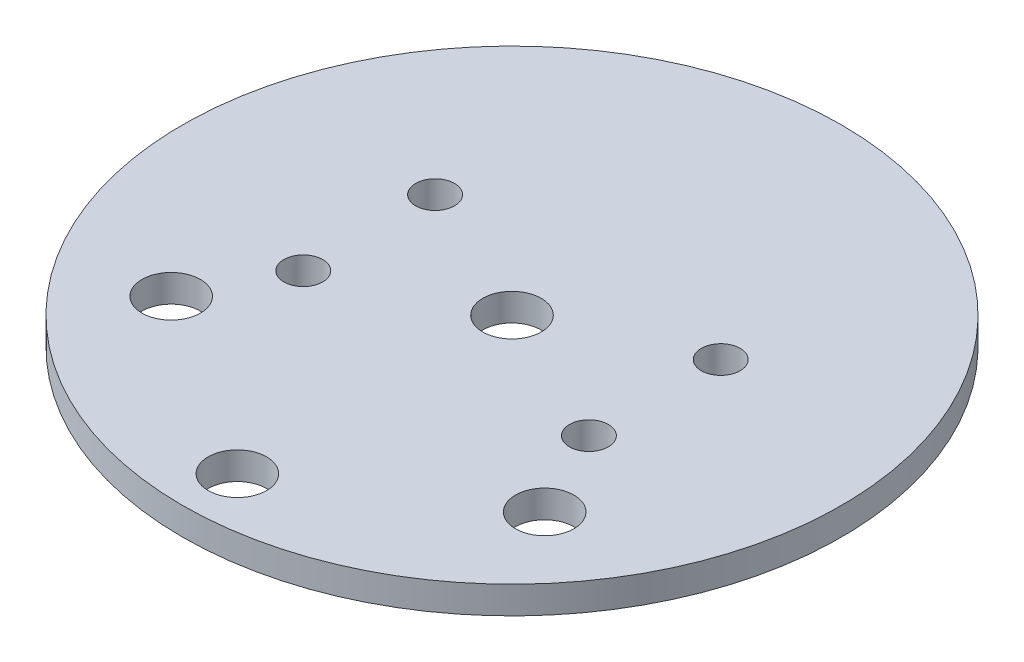
ISO-10303-21;
HEADER;
FILE_DESCRIPTION(('STEP AP214'),'2;1');
FILE_NAME('part.step','',(''),(''),'','','');
FILE_SCHEMA(('AUTOMOTIVE_DESIGN { 1 0 10303 214 1 1 1 1 }'));
ENDSEC;
DATA;
#1=APPLICATION_CONTEXT('core data for automotive mechanical design processes');
#2=APPLICATION_PROTOCOL_DEFINITION('international standard','automotive_design',2000,#1);
#3=PRODUCT_CONTEXT('',#1,'mechanical');
#4=PRODUCT('Part','Part','',(#3));
#5=PRODUCT_RELATED_PRODUCT_CATEGORY('part','',(#4));
#6=PRODUCT_DEFINITION_FORMATION('','',#4);
#7=PRODUCT_DEFINITION_CONTEXT('part definition',#1,'design');
#8=PRODUCT_DEFINITION('design','',#6,#7);
#9=PRODUCT_DEFINITION_SHAPE('','',#8);
#10=(LENGTH_UNIT() NAMED_UNIT(*) SI_UNIT(.MILLI.,.METRE.));
#11=(NAMED_UNIT(*) PLANE_ANGLE_UNIT() SI_UNIT($,.RADIAN.));
#12=(NAMED_UNIT(*) SI_UNIT($,.STERADIAN.) SOLID_ANGLE_UNIT());
#13=UNCERTAINTY_MEASURE_WITH_UNIT(LENGTH_MEASURE(1.E-05),#10,'distance_accuracy_value','');
#14=(GEOMETRIC_REPRESENTATION_CONTEXT(3) GLOBAL_UNCERTAINTY_ASSIGNED_CONTEXT((#13)) GLOBAL_UNIT_ASSIGNED_CONTEXT((#10,
#11,#12)) REPRESENTATION_CONTEXT('',''));
#15=CARTESIAN_POINT('',(0.,0.,0.));
#16=DIRECTION('',(0.,0.,1.));
#17=DIRECTION('',(1.,0.,0.));
#18=AXIS2_PLACEMENT_3D('',#15,#16,#17);
#19=CARTESIAN_POINT('',(0.,1.5875,0.));
#20=DIRECTION('',(0.,-1.,0.));
#21=DIRECTION('',(0.,0.,-1.));
#22=AXIS2_PLACEMENT_3D('',#19,#20,#21);
#23=CYLINDRICAL_SURFACE('',#22,38.1);
#24=CARTESIAN_POINT('',(0.,1.5875,0.));
#25=DIRECTION('',(0.,1.,0.));
#26=DIRECTION('',(0.,0.,1.));
#27=AXIS2_PLACEMENT_3D('',#24,#25,#26);
#28=CIRCLE('',#27,38.1);
#29=CARTESIAN_POINT('',(0.,1.5875,38.1));
#30=VERTEX_POINT('',#29);
#31=EDGE_CURVE('E10',#30,#30,#28,.T.);
#32=ORIENTED_EDGE('',*,*,#31,.F.);
#33=EDGE_LOOP('',(#32));
#34=FACE_BOUND('',#33,.T.);
#35=CARTESIAN_POINT('',(0.,-1.5875,0.));
#36=DIRECTION('',(0.,1.,0.));
#37=DIRECTION('',(0.,0.,1.));
#38=AXIS2_PLACEMENT_3D('',#35,#36,#37);
#39=CIRCLE('',#38,38.1);
#40=CARTESIAN_POINT('',(0.,-1.5875,38.1));
#41=VERTEX_POINT('',#40);
#42=EDGE_CURVE('E39',#41,#41,#39,.T.);
#43=ORIENTED_EDGE('',*,*,#42,.T.);
#44=EDGE_LOOP('',(#43));
#45=FACE_BOUND('',#44,.T.);
#46=ADVANCED_FACE('F36',(#34,#45),#23,.T.);
#47=CARTESIAN_POINT('',(0.,1.5875,0.));
#48=DIRECTION('',(0.,1.,0.));
#49=DIRECTION('',(0.,0.,1.));
#50=AXIS2_PLACEMENT_3D('',#47,#48,#49);
#51=PLANE('',#50);
#52=CARTESIAN_POINT('',(-16.51,1.5875,-7.62));
#53=DIRECTION('',(0.,1.,0.));
#54=DIRECTION('',(0.,0.,1.));
#55=AXIS2_PLACEMENT_3D('',#52,#53,#54);
#56=CIRCLE('',#55,2.24789999999999);
#57=CARTESIAN_POINT('',(-16.51,1.5875,-5.37210000000001));
#58=VERTEX_POINT('',#57);
#59=EDGE_CURVE('E92',#58,#58,#56,.T.);
#60=ORIENTED_EDGE('',*,*,#59,.F.);
#61=EDGE_LOOP('',(#60));
#62=FACE_BOUND('',#61,.T.);
#63=CARTESIAN_POINT('',(-16.51,1.5875,7.62));
#64=DIRECTION('',(0.,1.,0.));
#65=DIRECTION('',(0.,0.,1.));
#66=AXIS2_PLACEMENT_3D('',#63,#64,#65);
#67=CIRCLE('',#66,2.24789999999999);
#68=CARTESIAN_POINT('',(-16.51,1.5875,9.86789999999998));
#69=VERTEX_POINT('',#68);
#70=EDGE_CURVE('E86',#69,#69,#67,.T.);
#71=ORIENTED_EDGE('',*,*,#70,.F.);
#72=EDGE_LOOP('',(#71));
#73=FACE_BOUND('',#72,.T.);
#74=CARTESIAN_POINT('',(16.51,1.5875,7.62));
#75=DIRECTION('',(0.,1.,0.));
#76=DIRECTION('',(0.,0.,1.));
#77=AXIS2_PLACEMENT_3D('',#74,#75,#76);
#78=CIRCLE('',#77,2.24789999999999);
#79=CARTESIAN_POINT('',(16.51,1.5875,9.86789999999998));
#80=VERTEX_POINT('',#79);
#81=EDGE_CURVE('E80',#80,#80,#78,.T.);
#82=ORIENTED_EDGE('',*,*,#81,.F.);
#83=EDGE_LOOP('',(#82));
#84=FACE_BOUND('',#83,.T.);
#85=CARTESIAN_POINT('',(16.51,1.5875,-7.62));
#86=DIRECTION('',(0.,1.,0.));
#87=DIRECTION('',(0.,0.,1.));
#88=AXIS2_PLACEMENT_3D('',#85,#86,#87);
#89=CIRCLE('',#88,2.24789999999999);
#90=CARTESIAN_POINT('',(16.51,1.5875,-5.37210000000001));
#91=VERTEX_POINT('',#90);
#92=EDGE_CURVE('E74',#91,#91,#89,.T.);
#93=ORIENTED_EDGE('',*,*,#92,.F.);
#94=EDGE_LOOP('',(#93));
#95=FACE_BOUND('',#94,.T.);
#96=CARTESIAN_POINT('',(0.,1.5875,31.75));
#97=DIRECTION('',(0.,1.,0.));
#98=DIRECTION('',(0.,0.,1.));
#99=AXIS2_PLACEMENT_3D('',#96,#97,#98);
#100=CIRCLE('',#99,3.37819999999999);
#101=CARTESIAN_POINT('',(0.,1.5875,35.1282));
#102=VERTEX_POINT('',#101);
#103=EDGE_CURVE('E68',#102,#102,#100,.T.);
#104=ORIENTED_EDGE('',*,*,#103,.F.);
#105=EDGE_LOOP('',(#104));
#106=FACE_BOUND('',#105,.T.);
#107=CARTESIAN_POINT('',(0.,1.5875,0.));
#108=DIRECTION('',(0.,1.,0.));
#109=DIRECTION('',(0.,0.,1.));
#110=AXIS2_PLACEMENT_3D('',#107,#108,#109);
#111=CIRCLE('',#110,3.37819999999999);
#112=CARTESIAN_POINT('',(0.,1.5875,3.37819999999999));
#113=VERTEX_POINT('',#112);
#114=EDGE_CURVE('E62',#113,#113,#111,.T.);
#115=ORIENTED_EDGE('',*,*,#114,.F.);
#116=EDGE_LOOP('',(#115));
#117=FACE_BOUND('',#116,.T.);
#118=CARTESIAN_POINT('',(-21.59,1.5875,17.810706314));
#119=DIRECTION('',(0.,1.,0.));
#120=DIRECTION('',(0.,0.,1.));
#121=AXIS2_PLACEMENT_3D('',#118,#119,#120);
#122=CIRCLE('',#121,3.37819999999999);
#123=CARTESIAN_POINT('',(-21.59,1.5875,21.188906314));
#124=VERTEX_POINT('',#123);
#125=EDGE_CURVE('E56',#124,#124,#122,.T.);
#126=ORIENTED_EDGE('',*,*,#125,.F.);
#127=EDGE_LOOP('',(#126));
#128=FACE_BOUND('',#127,.T.);
#129=CARTESIAN_POINT('',(21.59,1.5875,17.810706314));
#130=DIRECTION('',(0.,1.,0.));
#131=DIRECTION('',(0.,0.,1.));
#132=AXIS2_PLACEMENT_3D('',#129,#130,#131);
#133=CIRCLE('',#132,3.37819999999999);
#134=CARTESIAN_POINT('',(21.59,1.5875,21.188906314));
#135=VERTEX_POINT('',#134);
#136=EDGE_CURVE('E50',#135,#135,#133,.T.);
#137=ORIENTED_EDGE('',*,*,#136,.F.);
#138=EDGE_LOOP('',(#137));
#139=FACE_BOUND('',#138,.T.);
#140=ORIENTED_EDGE('',*,*,#31,.T.);
#141=EDGE_LOOP('',(#140));
#142=FACE_BOUND('',#141,.T.);
#143=ADVANCED_FACE('F98',(#62,#73,#84,#95,#106,#117,#128,#139,#142),#51,.T.);
#144=CARTESIAN_POINT('',(0.,-1.5875,0.));
#145=DIRECTION('',(0.,1.,0.));
#146=DIRECTION('',(0.,0.,1.));
#147=AXIS2_PLACEMENT_3D('',#144,#145,#146);
#148=PLANE('',#147);
#149=CARTESIAN_POINT('',(-16.51,-1.5875,-7.62));
#150=DIRECTION('',(0.,1.,0.));
#151=DIRECTION('',(0.,0.,1.));
#152=AXIS2_PLACEMENT_3D('',#149,#150,#151);
#153=CIRCLE('',#152,2.24789999999998);
#154=CARTESIAN_POINT('',(-16.51,-1.5875,-5.37210000000002));
#155=VERTEX_POINT('',#154);
#156=EDGE_CURVE('E89',#155,#155,#153,.T.);
#157=ORIENTED_EDGE('',*,*,#156,.T.);
#158=EDGE_LOOP('',(#157));
#159=FACE_BOUND('',#158,.T.);
#160=CARTESIAN_POINT('',(-16.51,-1.5875,7.62));
#161=DIRECTION('',(0.,1.,0.));
#162=DIRECTION('',(0.,0.,1.));
#163=AXIS2_PLACEMENT_3D('',#160,#161,#162);
#164=CIRCLE('',#163,2.24789999999998);
#165=CARTESIAN_POINT('',(-16.51,-1.5875,9.86789999999998));
#166=VERTEX_POINT('',#165);
#167=EDGE_CURVE('E83',#166,#166,#164,.T.);
#168=ORIENTED_EDGE('',*,*,#167,.T.);
#169=EDGE_LOOP('',(#168));
#170=FACE_BOUND('',#169,.T.);
#171=CARTESIAN_POINT('',(16.51,-1.5875,7.62));
#172=DIRECTION('',(0.,1.,0.));
#173=DIRECTION('',(0.,0.,1.));
#174=AXIS2_PLACEMENT_3D('',#171,#172,#173);
#175=CIRCLE('',#174,2.24789999999998);
#176=CARTESIAN_POINT('',(16.51,-1.5875,9.86789999999998));
#177=VERTEX_POINT('',#176);
#178=EDGE_CURVE('E77',#177,#177,#175,.T.);
#179=ORIENTED_EDGE('',*,*,#178,.T.);
#180=EDGE_LOOP('',(#179));
#181=FACE_BOUND('',#180,.T.);
#182=CARTESIAN_POINT('',(16.51,-1.5875,-7.62));
#183=DIRECTION('',(0.,1.,0.));
#184=DIRECTION('',(0.,0.,1.));
#185=AXIS2_PLACEMENT_3D('',#182,#183,#184);
#186=CIRCLE('',#185,2.24789999999998);
#187=CARTESIAN_POINT('',(16.51,-1.5875,-5.37210000000002));
#188=VERTEX_POINT('',#187);
#189=EDGE_CURVE('E71',#188,#188,#186,.T.);
#190=ORIENTED_EDGE('',*,*,#189,.T.);
#191=EDGE_LOOP('',(#190));
#192=FACE_BOUND('',#191,.T.);
#193=CARTESIAN_POINT('',(0.,-1.5875,31.75));
#194=DIRECTION('',(0.,1.,0.));
#195=DIRECTION('',(0.,0.,1.));
#196=AXIS2_PLACEMENT_3D('',#193,#194,#195);
#197=CIRCLE('',#196,3.37819999999998);
#198=CARTESIAN_POINT('',(0.,-1.5875,35.1282));
#199=VERTEX_POINT('',#198);
#200=EDGE_CURVE('E65',#199,#199,#197,.T.);
#201=ORIENTED_EDGE('',*,*,#200,.T.);
#202=EDGE_LOOP('',(#201));
#203=FACE_BOUND('',#202,.T.);
#204=CARTESIAN_POINT('',(0.,-1.5875,0.));
#205=DIRECTION('',(0.,1.,0.));
#206=DIRECTION('',(0.,0.,1.));
#207=AXIS2_PLACEMENT_3D('',#204,#205,#206);
#208=CIRCLE('',#207,3.37819999999998);
#209=CARTESIAN_POINT('',(0.,-1.5875,3.37819999999998));
#210=VERTEX_POINT('',#209);
#211=EDGE_CURVE('E59',#210,#210,#208,.T.);
#212=ORIENTED_EDGE('',*,*,#211,.T.);
#213=EDGE_LOOP('',(#212));
#214=FACE_BOUND('',#213,.T.);
#215=CARTESIAN_POINT('',(-21.59,-1.5875,17.810706314));
#216=DIRECTION('',(0.,1.,0.));
#217=DIRECTION('',(0.,0.,1.));
#218=AXIS2_PLACEMENT_3D('',#215,#216,#217);
#219=CIRCLE('',#218,3.37819999999998);
#220=CARTESIAN_POINT('',(-21.59,-1.5875,21.188906314));
#221=VERTEX_POINT('',#220);
#222=EDGE_CURVE('E53',#221,#221,#219,.T.);
#223=ORIENTED_EDGE('',*,*,#222,.T.);
#224=EDGE_LOOP('',(#223));
#225=FACE_BOUND('',#224,.T.);
#226=CARTESIAN_POINT('',(21.59,-1.5875,17.810706314));
#227=DIRECTION('',(0.,1.,0.));
#228=DIRECTION('',(0.,0.,1.));
#229=AXIS2_PLACEMENT_3D('',#226,#227,#228);
#230=CIRCLE('',#229,3.37819999999998);
#231=CARTESIAN_POINT('',(21.59,-1.5875,21.188906314));
#232=VERTEX_POINT('',#231);
#233=EDGE_CURVE('E46',#232,#232,#230,.T.);
#234=ORIENTED_EDGE('',*,*,#233,.T.);
#235=EDGE_LOOP('',(#234));
#236=FACE_BOUND('',#235,.T.);
#237=ORIENTED_EDGE('',*,*,#42,.F.);
#238=EDGE_LOOP('',(#237));
#239=FACE_BOUND('',#238,.T.);
#240=ADVANCED_FACE('F101',(#159,#170,#181,#192,#203,#214,#225,#236,#239),#148,.F.);
#241=CARTESIAN_POINT('',(21.59,1.5875,17.810706314));
#242=DIRECTION('',(0.,1.,0.));
#243=DIRECTION('',(0.,0.,1.));
#244=AXIS2_PLACEMENT_3D('',#241,#242,#243);
#245=CYLINDRICAL_SURFACE('',#244,3.37819999999999);
#246=ORIENTED_EDGE('',*,*,#233,.F.);
#247=EDGE_LOOP('',(#246));
#248=FACE_BOUND('',#247,.T.);
#249=ORIENTED_EDGE('',*,*,#136,.T.);
#250=EDGE_LOOP('',(#249));
#251=FACE_BOUND('',#250,.T.);
#252=ADVANCED_FACE('F117',(#248,#251),#245,.F.);
#253=CARTESIAN_POINT('',(-21.59,1.5875,17.810706314));
#254=DIRECTION('',(0.,1.,0.));
#255=DIRECTION('',(0.,0.,1.));
#256=AXIS2_PLACEMENT_3D('',#253,#254,#255);
#257=CYLINDRICAL_SURFACE('',#256,3.37819999999999);
#258=ORIENTED_EDGE('',*,*,#222,.F.);
#259=EDGE_LOOP('',(#258));
#260=FACE_BOUND('',#259,.T.);
#261=ORIENTED_EDGE('',*,*,#125,.T.);
#262=EDGE_LOOP('',(#261));
#263=FACE_BOUND('',#262,.T.);
#264=ADVANCED_FACE('F119',(#260,#263),#257,.F.);
#265=CARTESIAN_POINT('',(0.,1.5875,0.));
#266=DIRECTION('',(0.,1.,0.));
#267=DIRECTION('',(0.,0.,1.));
#268=AXIS2_PLACEMENT_3D('',#265,#266,#267);
#269=CYLINDRICAL_SURFACE('',#268,3.37819999999999);
#270=ORIENTED_EDGE('',*,*,#211,.F.);
#271=EDGE_LOOP('',(#270));
#272=FACE_BOUND('',#271,.T.);
#273=ORIENTED_EDGE('',*,*,#114,.T.);
#274=EDGE_LOOP('',(#273));
#275=FACE_BOUND('',#274,.T.);
#276=ADVANCED_FACE('F126',(#272,#275),#269,.F.);
#277=CARTESIAN_POINT('',(0.,1.5875,31.75));
#278=DIRECTION('',(0.,1.,0.));
#279=DIRECTION('',(0.,0.,1.));
#280=AXIS2_PLACEMENT_3D('',#277,#278,#279);
#281=CYLINDRICAL_SURFACE('',#280,3.37819999999999);
#282=ORIENTED_EDGE('',*,*,#200,.F.);
#283=EDGE_LOOP('',(#282));
#284=FACE_BOUND('',#283,.T.);
#285=ORIENTED_EDGE('',*,*,#103,.T.);
#286=EDGE_LOOP('',(#285));
#287=FACE_BOUND('',#286,.T.);
#288=ADVANCED_FACE('F160',(#284,#287),#281,.F.);
#289=CARTESIAN_POINT('',(16.51,1.5875,-7.62));
#290=DIRECTION('',(0.,1.,0.));
#291=DIRECTION('',(0.,0.,1.));
#292=AXIS2_PLACEMENT_3D('',#289,#290,#291);
#293=CYLINDRICAL_SURFACE('',#292,2.24789999999998);
#294=ORIENTED_EDGE('',*,*,#189,.F.);
#295=EDGE_LOOP('',(#294));
#296=FACE_BOUND('',#295,.T.);
#297=ORIENTED_EDGE('',*,*,#92,.T.);
#298=EDGE_LOOP('',(#297));
#299=FACE_BOUND('',#298,.T.);
#300=ADVANCED_FACE('F154',(#296,#299),#293,.F.);
#301=CARTESIAN_POINT('',(16.51,1.5875,7.62));
#302=DIRECTION('',(0.,1.,0.));
#303=DIRECTION('',(0.,0.,1.));
#304=AXIS2_PLACEMENT_3D('',#301,#302,#303);
#305=CYLINDRICAL_SURFACE('',#304,2.24789999999998);
#306=ORIENTED_EDGE('',*,*,#178,.F.);
#307=EDGE_LOOP('',(#306));
#308=FACE_BOUND('',#307,.T.);
#309=ORIENTED_EDGE('',*,*,#81,.T.);
#310=EDGE_LOOP('',(#309));
#311=FACE_BOUND('',#310,.T.);
#312=ADVANCED_FACE('F159',(#308,#311),#305,.F.);
#313=CARTESIAN_POINT('',(-16.51,1.5875,7.62));
#314=DIRECTION('',(0.,1.,0.));
#315=DIRECTION('',(0.,0.,1.));
#316=AXIS2_PLACEMENT_3D('',#313,#314,#315);
#317=CYLINDRICAL_SURFACE('',#316,2.24789999999998);
#318=ORIENTED_EDGE('',*,*,#167,.F.);
#319=EDGE_LOOP('',(#318));
#320=FACE_BOUND('',#319,.T.);
#321=ORIENTED_EDGE('',*,*,#70,.T.);
#322=EDGE_LOOP('',(#321));
#323=FACE_BOUND('',#322,.T.);
#324=ADVANCED_FACE('F173',(#320,#323),#317,.F.);
#325=CARTESIAN_POINT('',(-16.51,1.5875,-7.62));
#326=DIRECTION('',(0.,1.,0.));
#327=DIRECTION('',(0.,0.,1.));
#328=AXIS2_PLACEMENT_3D('',#325,#326,#327);
#329=CYLINDRICAL_SURFACE('',#328,2.24789999999998);
#330=ORIENTED_EDGE('',*,*,#156,.F.);
#331=EDGE_LOOP('',(#330));
#332=FACE_BOUND('',#331,.T.);
#333=ORIENTED_EDGE('',*,*,#59,.T.);
#334=EDGE_LOOP('',(#333));
#335=FACE_BOUND('',#334,.T.);
#336=ADVANCED_FACE('F96',(#332,#335),#329,.F.);
#337=CLOSED_SHELL('',(#46,#143,#240,#252,#264,#276,#288,#300,#312,#324,#336));
#338=MANIFOLD_SOLID_BREP('B2',#337);
#339=ADVANCED_BREP_SHAPE_REPRESENTATION('',(#18,#338),#14);
#340=SHAPE_DEFINITION_REPRESENTATION(#9,#339);
ENDSEC;
END-ISO-10303-21;
